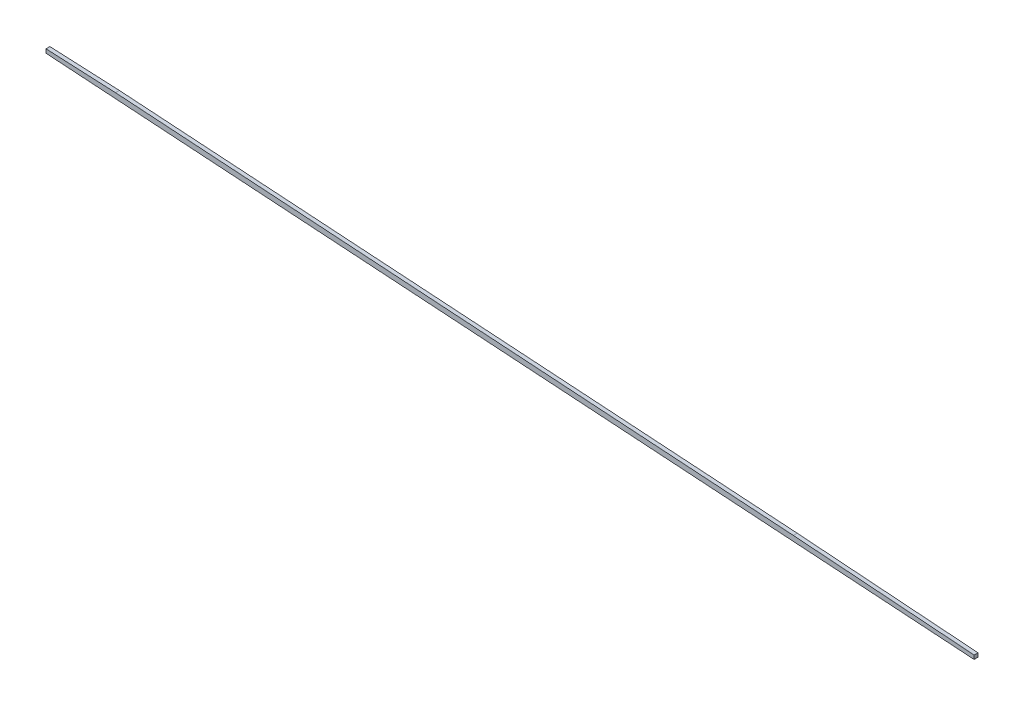
ISO-10303-21;
HEADER;
FILE_DESCRIPTION(('STEP AP214'),'2;1');
FILE_NAME('part.step','',(''),(''),'','','');
FILE_SCHEMA(('AUTOMOTIVE_DESIGN { 1 0 10303 214 1 1 1 1 }'));
ENDSEC;
DATA;
#1=APPLICATION_CONTEXT('core data for automotive mechanical design processes');
#2=APPLICATION_PROTOCOL_DEFINITION('international standard','automotive_design',2000,#1);
#3=PRODUCT_CONTEXT('',#1,'mechanical');
#4=PRODUCT('Part','Part','',(#3));
#5=PRODUCT_RELATED_PRODUCT_CATEGORY('part','',(#4));
#6=PRODUCT_DEFINITION_FORMATION('','',#4);
#7=PRODUCT_DEFINITION_CONTEXT('part definition',#1,'design');
#8=PRODUCT_DEFINITION('design','',#6,#7);
#9=PRODUCT_DEFINITION_SHAPE('','',#8);
#10=(LENGTH_UNIT() NAMED_UNIT(*) SI_UNIT(.MILLI.,.METRE.));
#11=(NAMED_UNIT(*) PLANE_ANGLE_UNIT() SI_UNIT($,.RADIAN.));
#12=(NAMED_UNIT(*) SI_UNIT($,.STERADIAN.) SOLID_ANGLE_UNIT());
#13=UNCERTAINTY_MEASURE_WITH_UNIT(LENGTH_MEASURE(1.E-05),#10,'distance_accuracy_value','');
#14=(GEOMETRIC_REPRESENTATION_CONTEXT(3) GLOBAL_UNCERTAINTY_ASSIGNED_CONTEXT((#13)) GLOBAL_UNIT_ASSIGNED_CONTEXT((#10,
#11,#12)) REPRESENTATION_CONTEXT('',''));
#15=CARTESIAN_POINT('',(0.,0.,0.));
#16=DIRECTION('',(0.,0.,1.));
#17=DIRECTION('',(1.,0.,0.));
#18=AXIS2_PLACEMENT_3D('',#15,#16,#17);
#19=CARTESIAN_POINT('',(-576.258316644534,73.5636883452141,3.));
#20=DIRECTION('',(1.,0.,0.));
#21=DIRECTION('',(0.,0.,-1.));
#22=AXIS2_PLACEMENT_3D('',#19,#20,#21);
#23=PLANE('',#22);
#24=DIRECTION('',(0.,-1.,0.));
#25=VECTOR('',#24,1.);
#26=CARTESIAN_POINT('',(-576.258316644534,73.5636883452141,0.));
#27=LINE('',#26,#25);
#28=CARTESIAN_POINT('',(-576.258316644534,76.5636883452141,0.));
#29=VERTEX_POINT('',#28);
#30=CARTESIAN_POINT('',(-576.258316644534,73.5636883452141,0.));
#31=VERTEX_POINT('',#30);
#32=EDGE_CURVE('E119',#29,#31,#27,.T.);
#33=ORIENTED_EDGE('',*,*,#32,.T.);
#34=DIRECTION('',(0.,0.,-1.));
#35=VECTOR('',#34,1.);
#36=CARTESIAN_POINT('',(-576.258316644534,73.5636883452141,3.));
#37=LINE('',#36,#35);
#38=CARTESIAN_POINT('',(-576.258316644534,73.5636883452141,3.));
#39=VERTEX_POINT('',#38);
#40=EDGE_CURVE('E11',#39,#31,#37,.T.);
#41=ORIENTED_EDGE('',*,*,#40,.F.);
#42=DIRECTION('',(0.,-1.,0.));
#43=VECTOR('',#42,1.);
#44=CARTESIAN_POINT('',(-576.258316644534,73.5636883452141,3.));
#45=LINE('',#44,#43);
#46=CARTESIAN_POINT('',(-576.258316644534,76.5636883452141,3.));
#47=VERTEX_POINT('',#46);
#48=EDGE_CURVE('E129',#47,#39,#45,.T.);
#49=ORIENTED_EDGE('',*,*,#48,.F.);
#50=DIRECTION('',(0.,0.,-1.));
#51=VECTOR('',#50,1.);
#52=CARTESIAN_POINT('',(-576.258316644534,76.5636883452141,3.));
#53=LINE('',#52,#51);
#54=EDGE_CURVE('E115',#47,#29,#53,.T.);
#55=ORIENTED_EDGE('',*,*,#54,.T.);
#56=EDGE_LOOP('',(#33,#41,#49,#55));
#57=FACE_BOUND('',#56,.T.);
#58=ADVANCED_FACE('F35',(#57),#23,.F.);
#59=CARTESIAN_POINT('',(-163.213476617076,46.444083941392,3.));
#60=DIRECTION('',(0.065516705614181,0.997851472557647,0.));
#61=DIRECTION('',(-0.997851472557647,0.065516705614181,0.));
#62=AXIS2_PLACEMENT_3D('',#59,#60,#61);
#63=PLANE('',#62);
#64=DIRECTION('',(0.997851472557647,-0.065516705614181,0.));
#65=VECTOR('',#64,1.);
#66=CARTESIAN_POINT('',(-163.213476617076,46.444083941392,0.));
#67=LINE('',#66,#65);
#68=CARTESIAN_POINT('',(142.473244876456,26.3733745291765,0.));
#69=VERTEX_POINT('',#68);
#70=EDGE_CURVE('E122',#31,#69,#67,.T.);
#71=ORIENTED_EDGE('',*,*,#70,.T.);
#72=DIRECTION('',(0.,0.,-1.));
#73=VECTOR('',#72,1.);
#74=CARTESIAN_POINT('',(142.473244876456,26.3733745291765,3.));
#75=LINE('',#74,#73);
#76=CARTESIAN_POINT('',(142.473244876456,26.3733745291765,3.));
#77=VERTEX_POINT('',#76);
#78=EDGE_CURVE('E43',#77,#69,#75,.T.);
#79=ORIENTED_EDGE('',*,*,#78,.F.);
#80=DIRECTION('',(0.997851472557647,-0.0655167056141782,0.));
#81=VECTOR('',#80,1.);
#82=CARTESIAN_POINT('',(-576.258316644534,73.5636883452141,3.));
#83=LINE('',#82,#81);
#84=EDGE_CURVE('E87',#39,#77,#83,.T.);
#85=ORIENTED_EDGE('',*,*,#84,.F.);
#86=ORIENTED_EDGE('',*,*,#40,.T.);
#87=EDGE_LOOP('',(#71,#79,#85,#86));
#88=FACE_BOUND('',#87,.T.);
#89=ADVANCED_FACE('F153',(#88),#63,.F.);
#90=CARTESIAN_POINT('',(142.473244876456,26.3733745291765,3.));
#91=DIRECTION('',(-0.999953692759649,0.00962353034710447,0.));
#92=DIRECTION('',(-0.00962353034710447,-0.999953692759649,0.));
#93=AXIS2_PLACEMENT_3D('',#90,#91,#92);
#94=PLANE('',#93);
#95=DIRECTION('',(0.00962353034710447,0.999953692759649,0.));
#96=VECTOR('',#95,1.);
#97=CARTESIAN_POINT('',(142.473244876456,26.3733745291765,0.));
#98=LINE('',#97,#96);
#99=CARTESIAN_POINT('',(142.502115467497,29.3732356074554,0.));
#100=VERTEX_POINT('',#99);
#101=EDGE_CURVE('E124',#69,#100,#98,.T.);
#102=ORIENTED_EDGE('',*,*,#101,.T.);
#103=DIRECTION('',(0.,0.,-1.));
#104=VECTOR('',#103,1.);
#105=CARTESIAN_POINT('',(142.502115467497,29.3732356074554,3.));
#106=LINE('',#105,#104);
#107=CARTESIAN_POINT('',(142.502115467497,29.3732356074554,3.));
#108=VERTEX_POINT('',#107);
#109=EDGE_CURVE('E110',#108,#100,#106,.T.);
#110=ORIENTED_EDGE('',*,*,#109,.F.);
#111=DIRECTION('',(0.00962353034710447,0.999953692759649,0.));
#112=VECTOR('',#111,1.);
#113=CARTESIAN_POINT('',(142.473244876456,26.3733745291765,3.));
#114=LINE('',#113,#112);
#115=EDGE_CURVE('E100',#77,#108,#114,.T.);
#116=ORIENTED_EDGE('',*,*,#115,.F.);
#117=ORIENTED_EDGE('',*,*,#78,.T.);
#118=EDGE_LOOP('',(#102,#110,#116,#117));
#119=FACE_BOUND('',#118,.T.);
#120=ADVANCED_FACE('F135',(#119),#94,.F.);
#121=CARTESIAN_POINT('',(2.49553743890147,39.565038712941,3.));
#122=DIRECTION('',(-0.0726030606424688,-0.997360915408934,0.));
#123=DIRECTION('',(0.997360915408934,-0.0726030606424688,0.));
#124=AXIS2_PLACEMENT_3D('',#121,#122,#123);
#125=PLANE('',#124);
#126=DIRECTION('',(-0.997360915408934,0.0726030606424688,0.));
#127=VECTOR('',#126,1.);
#128=CARTESIAN_POINT('',(2.49553743890147,39.565038712941,0.));
#129=LINE('',#128,#127);
#130=CARTESIAN_POINT('',(2.49553743890147,39.565038712941,0.));
#131=VERTEX_POINT('',#130);
#132=EDGE_CURVE('E109',#100,#131,#129,.T.);
#133=ORIENTED_EDGE('',*,*,#132,.T.);
#134=DIRECTION('',(0.,0.,-1.));
#135=VECTOR('',#134,1.);
#136=CARTESIAN_POINT('',(2.49553743890147,39.565038712941,3.));
#137=LINE('',#136,#135);
#138=CARTESIAN_POINT('',(2.49553743890147,39.565038712941,3.));
#139=VERTEX_POINT('',#138);
#140=EDGE_CURVE('E106',#139,#131,#137,.T.);
#141=ORIENTED_EDGE('',*,*,#140,.F.);
#142=DIRECTION('',(-0.997360915408934,0.0726030606424688,0.));
#143=VECTOR('',#142,1.);
#144=CARTESIAN_POINT('',(2.49553743890147,39.565038712941,3.));
#145=LINE('',#144,#143);
#146=EDGE_CURVE('E94',#108,#139,#145,.T.);
#147=ORIENTED_EDGE('',*,*,#146,.F.);
#148=ORIENTED_EDGE('',*,*,#109,.T.);
#149=EDGE_LOOP('',(#133,#141,#147,#148));
#150=FACE_BOUND('',#149,.T.);
#151=ADVANCED_FACE('F107',(#150),#125,.F.);
#152=CARTESIAN_POINT('',(-522.440006737828,74.0311375864412,3.));
#153=DIRECTION('',(-0.0655167056141668,-0.997851472557648,0.));
#154=DIRECTION('',(0.997851472557648,-0.0655167056141668,0.));
#155=AXIS2_PLACEMENT_3D('',#152,#153,#154);
#156=PLANE('',#155);
#157=DIRECTION('',(-0.997851472557648,0.0655167056141668,0.));
#158=VECTOR('',#157,1.);
#159=CARTESIAN_POINT('',(-522.440006737828,74.0311375864412,0.));
#160=LINE('',#159,#158);
#161=CARTESIAN_POINT('',(-522.440006737828,74.0311375864412,0.));
#162=VERTEX_POINT('',#161);
#163=EDGE_CURVE('E73',#131,#162,#160,.T.);
#164=ORIENTED_EDGE('',*,*,#163,.T.);
#165=DIRECTION('',(0.,0.,-1.));
#166=VECTOR('',#165,1.);
#167=CARTESIAN_POINT('',(-522.440006737828,74.0311375864412,3.));
#168=LINE('',#167,#166);
#169=CARTESIAN_POINT('',(-522.440006737828,74.0311375864412,3.));
#170=VERTEX_POINT('',#169);
#171=EDGE_CURVE('E111',#170,#162,#168,.T.);
#172=ORIENTED_EDGE('',*,*,#171,.F.);
#173=DIRECTION('',(-0.997851472557648,0.0655167056141677,0.));
#174=VECTOR('',#173,1.);
#175=CARTESIAN_POINT('',(-372.762285854181,64.2036317443161,3.));
#176=LINE('',#175,#174);
#177=EDGE_CURVE('E98',#139,#170,#176,.T.);
#178=ORIENTED_EDGE('',*,*,#177,.F.);
#179=ORIENTED_EDGE('',*,*,#140,.T.);
#180=EDGE_LOOP('',(#164,#172,#178,#179));
#181=FACE_BOUND('',#180,.T.);
#182=ADVANCED_FACE('F113',(#181),#156,.F.);
#183=CARTESIAN_POINT('',(-576.258316644534,76.5636883452141,3.));
#184=DIRECTION('',(-0.0470054033742414,-0.998894635111043,0.));
#185=DIRECTION('',(0.998894635111044,-0.0470054033742414,0.));
#186=AXIS2_PLACEMENT_3D('',#183,#184,#185);
#187=PLANE('',#186);
#188=DIRECTION('',(-0.998894635111044,0.0470054033742414,0.));
#189=VECTOR('',#188,1.);
#190=CARTESIAN_POINT('',(-576.258316644534,76.5636883452141,0.));
#191=LINE('',#190,#189);
#192=EDGE_CURVE('E79',#162,#29,#191,.T.);
#193=ORIENTED_EDGE('',*,*,#192,.T.);
#194=ORIENTED_EDGE('',*,*,#54,.F.);
#195=DIRECTION('',(-0.998894635111044,0.0470054033742414,0.));
#196=VECTOR('',#195,1.);
#197=CARTESIAN_POINT('',(-576.258316644534,76.5636883452141,3.));
#198=LINE('',#197,#196);
#199=EDGE_CURVE('E51',#170,#47,#198,.T.);
#200=ORIENTED_EDGE('',*,*,#199,.F.);
#201=ORIENTED_EDGE('',*,*,#171,.T.);
#202=EDGE_LOOP('',(#193,#194,#200,#201));
#203=FACE_BOUND('',#202,.T.);
#204=ADVANCED_FACE('F142',(#203),#187,.F.);
#205=CARTESIAN_POINT('',(0.,0.,3.));
#206=DIRECTION('',(0.,0.,-1.));
#207=DIRECTION('',(-1.,0.,0.));
#208=AXIS2_PLACEMENT_3D('',#205,#206,#207);
#209=PLANE('',#208);
#210=ORIENTED_EDGE('',*,*,#48,.T.);
#211=ORIENTED_EDGE('',*,*,#84,.T.);
#212=ORIENTED_EDGE('',*,*,#115,.T.);
#213=ORIENTED_EDGE('',*,*,#146,.T.);
#214=ORIENTED_EDGE('',*,*,#177,.T.);
#215=ORIENTED_EDGE('',*,*,#199,.T.);
#216=EDGE_LOOP('',(#210,#211,#212,#213,#214,#215));
#217=FACE_BOUND('',#216,.T.);
#218=ADVANCED_FACE('F96',(#217),#209,.F.);
#219=CARTESIAN_POINT('',(0.,0.,0.));
#220=DIRECTION('',(0.,0.,-1.));
#221=DIRECTION('',(-1.,0.,0.));
#222=AXIS2_PLACEMENT_3D('',#219,#220,#221);
#223=PLANE('',#222);
#224=ORIENTED_EDGE('',*,*,#32,.F.);
#225=ORIENTED_EDGE('',*,*,#192,.F.);
#226=ORIENTED_EDGE('',*,*,#163,.F.);
#227=ORIENTED_EDGE('',*,*,#132,.F.);
#228=ORIENTED_EDGE('',*,*,#101,.F.);
#229=ORIENTED_EDGE('',*,*,#70,.F.);
#230=EDGE_LOOP('',(#224,#225,#226,#227,#228,#229));
#231=FACE_BOUND('',#230,.T.);
#232=ADVANCED_FACE('F138',(#231),#223,.T.);
#233=CLOSED_SHELL('',(#58,#89,#120,#151,#182,#204,#218,#232));
#234=MANIFOLD_SOLID_BREP('B2',#233);
#235=ADVANCED_BREP_SHAPE_REPRESENTATION('',(#18,#234),#14);
#236=SHAPE_DEFINITION_REPRESENTATION(#9,#235);
ENDSEC;
END-ISO-10303-21;
